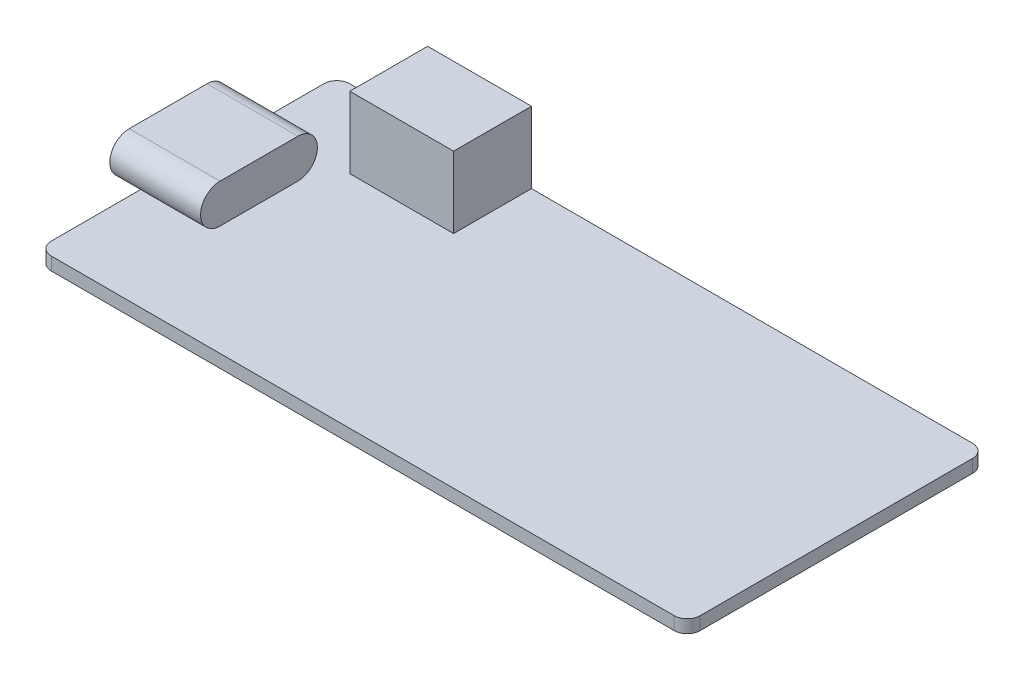
ISO-10303-21;
HEADER;
FILE_DESCRIPTION(('STEP AP214'),'2;1');
FILE_NAME('part.step','',(''),(''),'','','');
FILE_SCHEMA(('AUTOMOTIVE_DESIGN { 1 0 10303 214 1 1 1 1 }'));
ENDSEC;
DATA;
#1=APPLICATION_CONTEXT('core data for automotive mechanical design processes');
#2=APPLICATION_PROTOCOL_DEFINITION('international standard','automotive_design',2000,#1);
#3=PRODUCT_CONTEXT('',#1,'mechanical');
#4=PRODUCT('Part','Part','',(#3));
#5=PRODUCT_RELATED_PRODUCT_CATEGORY('part','',(#4));
#6=PRODUCT_DEFINITION_FORMATION('','',#4);
#7=PRODUCT_DEFINITION_CONTEXT('part definition',#1,'design');
#8=PRODUCT_DEFINITION('design','',#6,#7);
#9=PRODUCT_DEFINITION_SHAPE('','',#8);
#10=(LENGTH_UNIT() NAMED_UNIT(*) SI_UNIT(.MILLI.,.METRE.));
#11=(NAMED_UNIT(*) PLANE_ANGLE_UNIT() SI_UNIT($,.RADIAN.));
#12=(NAMED_UNIT(*) SI_UNIT($,.STERADIAN.) SOLID_ANGLE_UNIT());
#13=UNCERTAINTY_MEASURE_WITH_UNIT(LENGTH_MEASURE(1.E-05),#10,'distance_accuracy_value','');
#14=(GEOMETRIC_REPRESENTATION_CONTEXT(3) GLOBAL_UNCERTAINTY_ASSIGNED_CONTEXT((#13)) GLOBAL_UNIT_ASSIGNED_CONTEXT((#10,
#11,#12)) REPRESENTATION_CONTEXT('',''));
#15=CARTESIAN_POINT('',(0.,0.,0.));
#16=DIRECTION('',(0.,0.,1.));
#17=DIRECTION('',(1.,0.,0.));
#18=AXIS2_PLACEMENT_3D('',#15,#16,#17);
#19=CARTESIAN_POINT('',(0.,1.,0.));
#20=DIRECTION('',(0.,-1.,0.));
#21=DIRECTION('',(0.,0.,-1.));
#22=AXIS2_PLACEMENT_3D('',#19,#20,#21);
#23=PLANE('',#22);
#24=DIRECTION('',(0.,0.,1.));
#25=VECTOR('',#24,1.);
#26=CARTESIAN_POINT('',(7.,1.,-23.));
#27=LINE('',#26,#25);
#28=CARTESIAN_POINT('',(7.,1.,-23.));
#29=VERTEX_POINT('',#28);
#30=CARTESIAN_POINT('',(7.,1.,-17.));
#31=VERTEX_POINT('',#30);
#32=EDGE_CURVE('E172',#29,#31,#27,.T.);
#33=ORIENTED_EDGE('',*,*,#32,.F.);
#34=DIRECTION('',(-1.,0.,0.));
#35=VECTOR('',#34,1.);
#36=CARTESIAN_POINT('',(0.,1.,-23.));
#37=LINE('',#36,#35);
#38=CARTESIAN_POINT('',(1.,1.,-23.));
#39=VERTEX_POINT('',#38);
#40=EDGE_CURVE('E224',#29,#39,#37,.T.);
#41=ORIENTED_EDGE('',*,*,#40,.T.);
#42=CARTESIAN_POINT('',(1.,1.,-22.));
#43=DIRECTION('',(0.,-1.,0.));
#44=DIRECTION('',(0.,0.,-1.));
#45=AXIS2_PLACEMENT_3D('',#42,#43,#44);
#46=CIRCLE('',#45,1.);
#47=CARTESIAN_POINT('',(0.,1.,-22.));
#48=VERTEX_POINT('',#47);
#49=EDGE_CURVE('E258',#39,#48,#46,.F.);
#50=ORIENTED_EDGE('',*,*,#49,.T.);
#51=DIRECTION('',(0.,0.,1.));
#52=VECTOR('',#51,1.);
#53=CARTESIAN_POINT('',(0.,1.,0.));
#54=LINE('',#53,#52);
#55=CARTESIAN_POINT('',(0.,1.,-14.5));
#56=VERTEX_POINT('',#55);
#57=EDGE_CURVE('E213',#48,#56,#54,.T.);
#58=ORIENTED_EDGE('',*,*,#57,.T.);
#59=DIRECTION('',(-1.,0.,0.));
#60=VECTOR('',#59,1.);
#61=CARTESIAN_POINT('',(5.5,0.999999999999999,-14.5));
#62=LINE('',#61,#60);
#63=CARTESIAN_POINT('',(5.5,0.999999999999999,-14.5));
#64=VERTEX_POINT('',#63);
#65=EDGE_CURVE('E206',#64,#56,#62,.T.);
#66=ORIENTED_EDGE('',*,*,#65,.F.);
#67=DIRECTION('',(0.,0.,1.));
#68=VECTOR('',#67,1.);
#69=CARTESIAN_POINT('',(5.5,0.999999999999999,-8.5));
#70=LINE('',#69,#68);
#71=CARTESIAN_POINT('',(5.5,1.,-8.5));
#72=VERTEX_POINT('',#71);
#73=EDGE_CURVE('E199',#64,#72,#70,.T.);
#74=ORIENTED_EDGE('',*,*,#73,.T.);
#75=DIRECTION('',(-1.,0.,0.));
#76=VECTOR('',#75,1.);
#77=CARTESIAN_POINT('',(5.5,0.999999999999999,-8.5));
#78=LINE('',#77,#76);
#79=CARTESIAN_POINT('',(0.,1.,-8.5));
#80=VERTEX_POINT('',#79);
#81=EDGE_CURVE('E202',#72,#80,#78,.T.);
#82=ORIENTED_EDGE('',*,*,#81,.T.);
#83=CARTESIAN_POINT('',(0.,1.,-1.));
#84=VERTEX_POINT('',#83);
#85=EDGE_CURVE('E218',#80,#84,#54,.T.);
#86=ORIENTED_EDGE('',*,*,#85,.T.);
#87=CARTESIAN_POINT('',(1.,1.,-1.));
#88=DIRECTION('',(0.,-1.,0.));
#89=DIRECTION('',(0.,0.,-1.));
#90=AXIS2_PLACEMENT_3D('',#87,#88,#89);
#91=CIRCLE('',#90,1.);
#92=CARTESIAN_POINT('',(1.,1.,0.));
#93=VERTEX_POINT('',#92);
#94=EDGE_CURVE('E256',#84,#93,#91,.F.);
#95=ORIENTED_EDGE('',*,*,#94,.T.);
#96=DIRECTION('',(1.,0.,0.));
#97=VECTOR('',#96,1.);
#98=CARTESIAN_POINT('',(0.,1.,0.));
#99=LINE('',#98,#97);
#100=CARTESIAN_POINT('',(49.,1.,0.));
#101=VERTEX_POINT('',#100);
#102=EDGE_CURVE('E216',#93,#101,#99,.T.);
#103=ORIENTED_EDGE('',*,*,#102,.T.);
#104=CARTESIAN_POINT('',(49.,1.,-1.));
#105=DIRECTION('',(0.,-1.,0.));
#106=DIRECTION('',(0.,0.,-1.));
#107=AXIS2_PLACEMENT_3D('',#104,#105,#106);
#108=CIRCLE('',#107,1.);
#109=CARTESIAN_POINT('',(50.,1.,-1.));
#110=VERTEX_POINT('',#109);
#111=EDGE_CURVE('E262',#101,#110,#108,.F.);
#112=ORIENTED_EDGE('',*,*,#111,.T.);
#113=DIRECTION('',(0.,0.,-1.));
#114=VECTOR('',#113,1.);
#115=CARTESIAN_POINT('',(50.,1.,0.));
#116=LINE('',#115,#114);
#117=CARTESIAN_POINT('',(50.,1.,-22.));
#118=VERTEX_POINT('',#117);
#119=EDGE_CURVE('E221',#110,#118,#116,.T.);
#120=ORIENTED_EDGE('',*,*,#119,.T.);
#121=CARTESIAN_POINT('',(49.,1.,-22.));
#122=DIRECTION('',(0.,-1.,0.));
#123=DIRECTION('',(0.,0.,-1.));
#124=AXIS2_PLACEMENT_3D('',#121,#122,#123);
#125=CIRCLE('',#124,1.);
#126=CARTESIAN_POINT('',(49.,1.,-23.));
#127=VERTEX_POINT('',#126);
#128=EDGE_CURVE('E260',#118,#127,#125,.F.);
#129=ORIENTED_EDGE('',*,*,#128,.T.);
#130=CARTESIAN_POINT('',(15.,1.,-23.));
#131=VERTEX_POINT('',#130);
#132=EDGE_CURVE('E225',#127,#131,#37,.T.);
#133=ORIENTED_EDGE('',*,*,#132,.T.);
#134=DIRECTION('',(0.,0.,-1.));
#135=VECTOR('',#134,1.);
#136=CARTESIAN_POINT('',(15.,1.,-23.));
#137=LINE('',#136,#135);
#138=CARTESIAN_POINT('',(15.,1.,-17.));
#139=VERTEX_POINT('',#138);
#140=EDGE_CURVE('E53',#139,#131,#137,.T.);
#141=ORIENTED_EDGE('',*,*,#140,.F.);
#142=DIRECTION('',(1.,0.,0.));
#143=VECTOR('',#142,1.);
#144=CARTESIAN_POINT('',(7.,1.,-17.));
#145=LINE('',#144,#143);
#146=EDGE_CURVE('E48',#31,#139,#145,.T.);
#147=ORIENTED_EDGE('',*,*,#146,.F.);
#148=EDGE_LOOP('',(#33,#41,#50,#58,#66,#74,#82,#86,#95,#103,#112,#120,#129,#133,#141,#147));
#149=FACE_BOUND('',#148,.T.);
#150=ADVANCED_FACE('F33',(#149),#23,.F.);
#151=CARTESIAN_POINT('',(0.,1.,0.));
#152=DIRECTION('',(1.,0.,0.));
#153=DIRECTION('',(0.,0.,-1.));
#154=AXIS2_PLACEMENT_3D('',#151,#152,#153);
#155=PLANE('',#154);
#156=ORIENTED_EDGE('',*,*,#57,.F.);
#157=DIRECTION('',(0.,-1.,0.));
#158=VECTOR('',#157,1.);
#159=CARTESIAN_POINT('',(0.,1.,-22.));
#160=LINE('',#159,#158);
#161=CARTESIAN_POINT('',(0.,0.,-22.));
#162=VERTEX_POINT('',#161);
#163=EDGE_CURVE('E11',#48,#162,#160,.T.);
#164=ORIENTED_EDGE('',*,*,#163,.T.);
#165=DIRECTION('',(0.,0.,1.));
#166=VECTOR('',#165,1.);
#167=CARTESIAN_POINT('',(0.,0.,0.));
#168=LINE('',#167,#166);
#169=CARTESIAN_POINT('',(0.,0.,-1.));
#170=VERTEX_POINT('',#169);
#171=EDGE_CURVE('E204',#162,#170,#168,.T.);
#172=ORIENTED_EDGE('',*,*,#171,.T.);
#173=DIRECTION('',(0.,-1.,0.));
#174=VECTOR('',#173,1.);
#175=CARTESIAN_POINT('',(0.,1.,-1.));
#176=LINE('',#175,#174);
#177=EDGE_CURVE('E41',#170,#84,#176,.F.);
#178=ORIENTED_EDGE('',*,*,#177,.T.);
#179=ORIENTED_EDGE('',*,*,#85,.F.);
#180=EDGE_CURVE('E217',#56,#80,#54,.T.);
#181=ORIENTED_EDGE('',*,*,#180,.F.);
#182=EDGE_LOOP('',(#156,#164,#172,#178,#179,#181));
#183=FACE_BOUND('',#182,.T.);
#184=ADVANCED_FACE('F275',(#183),#155,.F.);
#185=CARTESIAN_POINT('',(0.,1.,0.));
#186=DIRECTION('',(0.,0.,-1.));
#187=DIRECTION('',(-1.,0.,0.));
#188=AXIS2_PLACEMENT_3D('',#185,#186,#187);
#189=PLANE('',#188);
#190=DIRECTION('',(1.,0.,0.));
#191=VECTOR('',#190,1.);
#192=CARTESIAN_POINT('',(0.,0.,0.));
#193=LINE('',#192,#191);
#194=CARTESIAN_POINT('',(1.,0.,0.));
#195=VERTEX_POINT('',#194);
#196=CARTESIAN_POINT('',(49.,0.,0.));
#197=VERTEX_POINT('',#196);
#198=EDGE_CURVE('E230',#195,#197,#193,.T.);
#199=ORIENTED_EDGE('',*,*,#198,.T.);
#200=DIRECTION('',(0.,-1.,0.));
#201=VECTOR('',#200,1.);
#202=CARTESIAN_POINT('',(49.,1.,0.));
#203=LINE('',#202,#201);
#204=EDGE_CURVE('E254',#197,#101,#203,.F.);
#205=ORIENTED_EDGE('',*,*,#204,.T.);
#206=ORIENTED_EDGE('',*,*,#102,.F.);
#207=DIRECTION('',(0.,-1.,0.));
#208=VECTOR('',#207,1.);
#209=CARTESIAN_POINT('',(1.,1.,0.));
#210=LINE('',#209,#208);
#211=EDGE_CURVE('E251',#93,#195,#210,.T.);
#212=ORIENTED_EDGE('',*,*,#211,.T.);
#213=EDGE_LOOP('',(#199,#205,#206,#212));
#214=FACE_BOUND('',#213,.T.);
#215=ADVANCED_FACE('F283',(#214),#189,.F.);
#216=CARTESIAN_POINT('',(50.,1.,0.));
#217=DIRECTION('',(-1.,0.,0.));
#218=DIRECTION('',(0.,0.,1.));
#219=AXIS2_PLACEMENT_3D('',#216,#217,#218);
#220=PLANE('',#219);
#221=ORIENTED_EDGE('',*,*,#119,.F.);
#222=DIRECTION('',(0.,-1.,0.));
#223=VECTOR('',#222,1.);
#224=CARTESIAN_POINT('',(50.,1.,-1.));
#225=LINE('',#224,#223);
#226=CARTESIAN_POINT('',(50.,0.,-1.));
#227=VERTEX_POINT('',#226);
#228=EDGE_CURVE('E240',#110,#227,#225,.T.);
#229=ORIENTED_EDGE('',*,*,#228,.T.);
#230=DIRECTION('',(0.,0.,-1.));
#231=VECTOR('',#230,1.);
#232=CARTESIAN_POINT('',(50.,0.,0.));
#233=LINE('',#232,#231);
#234=CARTESIAN_POINT('',(50.,0.,-22.));
#235=VERTEX_POINT('',#234);
#236=EDGE_CURVE('E233',#227,#235,#233,.T.);
#237=ORIENTED_EDGE('',*,*,#236,.T.);
#238=DIRECTION('',(0.,-1.,0.));
#239=VECTOR('',#238,1.);
#240=CARTESIAN_POINT('',(50.,1.,-22.));
#241=LINE('',#240,#239);
#242=EDGE_CURVE('E227',#235,#118,#241,.F.);
#243=ORIENTED_EDGE('',*,*,#242,.T.);
#244=EDGE_LOOP('',(#221,#229,#237,#243));
#245=FACE_BOUND('',#244,.T.);
#246=ADVANCED_FACE('F292',(#245),#220,.F.);
#247=CARTESIAN_POINT('',(0.,1.,-23.));
#248=DIRECTION('',(0.,0.,1.));
#249=DIRECTION('',(1.,0.,0.));
#250=AXIS2_PLACEMENT_3D('',#247,#248,#249);
#251=PLANE('',#250);
#252=ORIENTED_EDGE('',*,*,#132,.F.);
#253=DIRECTION('',(0.,-1.,0.));
#254=VECTOR('',#253,1.);
#255=CARTESIAN_POINT('',(49.,1.,-23.));
#256=LINE('',#255,#254);
#257=CARTESIAN_POINT('',(49.,0.,-23.));
#258=VERTEX_POINT('',#257);
#259=EDGE_CURVE('E267',#127,#258,#256,.T.);
#260=ORIENTED_EDGE('',*,*,#259,.T.);
#261=DIRECTION('',(-1.,0.,0.));
#262=VECTOR('',#261,1.);
#263=CARTESIAN_POINT('',(0.,0.,-23.));
#264=LINE('',#263,#262);
#265=CARTESIAN_POINT('',(1.,0.,-23.));
#266=VERTEX_POINT('',#265);
#267=EDGE_CURVE('E236',#258,#266,#264,.T.);
#268=ORIENTED_EDGE('',*,*,#267,.T.);
#269=DIRECTION('',(0.,-1.,0.));
#270=VECTOR('',#269,1.);
#271=CARTESIAN_POINT('',(1.,1.,-23.));
#272=LINE('',#271,#270);
#273=EDGE_CURVE('E264',#266,#39,#272,.F.);
#274=ORIENTED_EDGE('',*,*,#273,.T.);
#275=ORIENTED_EDGE('',*,*,#40,.F.);
#276=DIRECTION('',(0.,-1.,0.));
#277=VECTOR('',#276,1.);
#278=CARTESIAN_POINT('',(7.,6.5,-23.));
#279=LINE('',#278,#277);
#280=CARTESIAN_POINT('',(7.,6.5,-23.));
#281=VERTEX_POINT('',#280);
#282=EDGE_CURVE('E305',#281,#29,#279,.T.);
#283=ORIENTED_EDGE('',*,*,#282,.F.);
#284=DIRECTION('',(-1.,0.,0.));
#285=VECTOR('',#284,1.);
#286=CARTESIAN_POINT('',(7.,6.5,-23.));
#287=LINE('',#286,#285);
#288=CARTESIAN_POINT('',(15.,6.5,-23.));
#289=VERTEX_POINT('',#288);
#290=EDGE_CURVE('E166',#289,#281,#287,.T.);
#291=ORIENTED_EDGE('',*,*,#290,.F.);
#292=DIRECTION('',(0.,-1.,0.));
#293=VECTOR('',#292,1.);
#294=CARTESIAN_POINT('',(15.,6.5,-23.));
#295=LINE('',#294,#293);
#296=EDGE_CURVE('E178',#289,#131,#295,.T.);
#297=ORIENTED_EDGE('',*,*,#296,.T.);
#298=EDGE_LOOP('',(#252,#260,#268,#274,#275,#283,#291,#297));
#299=FACE_BOUND('',#298,.T.);
#300=ADVANCED_FACE('F301',(#299),#251,.F.);
#301=CARTESIAN_POINT('',(0.,0.,0.));
#302=DIRECTION('',(0.,-1.,0.));
#303=DIRECTION('',(0.,0.,-1.));
#304=AXIS2_PLACEMENT_3D('',#301,#302,#303);
#305=PLANE('',#304);
#306=ORIENTED_EDGE('',*,*,#236,.F.);
#307=CARTESIAN_POINT('',(49.,0.,-1.));
#308=DIRECTION('',(0.,-1.,0.));
#309=DIRECTION('',(0.,0.,-1.));
#310=AXIS2_PLACEMENT_3D('',#307,#308,#309);
#311=CIRCLE('',#310,1.);
#312=EDGE_CURVE('E249',#227,#197,#311,.T.);
#313=ORIENTED_EDGE('',*,*,#312,.T.);
#314=ORIENTED_EDGE('',*,*,#198,.F.);
#315=CARTESIAN_POINT('',(1.,0.,-1.));
#316=DIRECTION('',(0.,-1.,0.));
#317=DIRECTION('',(0.,0.,-1.));
#318=AXIS2_PLACEMENT_3D('',#315,#316,#317);
#319=CIRCLE('',#318,1.);
#320=EDGE_CURVE('E243',#195,#170,#319,.T.);
#321=ORIENTED_EDGE('',*,*,#320,.T.);
#322=ORIENTED_EDGE('',*,*,#171,.F.);
#323=CARTESIAN_POINT('',(1.,0.,-22.));
#324=DIRECTION('',(0.,-1.,0.));
#325=DIRECTION('',(0.,0.,-1.));
#326=AXIS2_PLACEMENT_3D('',#323,#324,#325);
#327=CIRCLE('',#326,1.);
#328=EDGE_CURVE('E245',#162,#266,#327,.T.);
#329=ORIENTED_EDGE('',*,*,#328,.T.);
#330=ORIENTED_EDGE('',*,*,#267,.F.);
#331=CARTESIAN_POINT('',(49.,0.,-22.));
#332=DIRECTION('',(0.,-1.,0.));
#333=DIRECTION('',(0.,0.,-1.));
#334=AXIS2_PLACEMENT_3D('',#331,#332,#333);
#335=CIRCLE('',#334,1.);
#336=EDGE_CURVE('E247',#258,#235,#335,.T.);
#337=ORIENTED_EDGE('',*,*,#336,.T.);
#338=EDGE_LOOP('',(#306,#313,#314,#321,#322,#329,#330,#337));
#339=FACE_BOUND('',#338,.T.);
#340=ADVANCED_FACE('F331',(#339),#305,.T.);
#341=CARTESIAN_POINT('',(49.,1.,-1.));
#342=DIRECTION('',(0.,-1.,0.));
#343=DIRECTION('',(0.,0.,-1.));
#344=AXIS2_PLACEMENT_3D('',#341,#342,#343);
#345=CYLINDRICAL_SURFACE('',#344,1.);
#346=ORIENTED_EDGE('',*,*,#111,.F.);
#347=ORIENTED_EDGE('',*,*,#204,.F.);
#348=ORIENTED_EDGE('',*,*,#312,.F.);
#349=ORIENTED_EDGE('',*,*,#228,.F.);
#350=EDGE_LOOP('',(#346,#347,#348,#349));
#351=FACE_BOUND('',#350,.T.);
#352=ADVANCED_FACE('F287',(#351),#345,.T.);
#353=CARTESIAN_POINT('',(49.,1.,-22.));
#354=DIRECTION('',(0.,-1.,0.));
#355=DIRECTION('',(0.,0.,-1.));
#356=AXIS2_PLACEMENT_3D('',#353,#354,#355);
#357=CYLINDRICAL_SURFACE('',#356,1.);
#358=ORIENTED_EDGE('',*,*,#128,.F.);
#359=ORIENTED_EDGE('',*,*,#242,.F.);
#360=ORIENTED_EDGE('',*,*,#336,.F.);
#361=ORIENTED_EDGE('',*,*,#259,.F.);
#362=EDGE_LOOP('',(#358,#359,#360,#361));
#363=FACE_BOUND('',#362,.T.);
#364=ADVANCED_FACE('F296',(#363),#357,.T.);
#365=CARTESIAN_POINT('',(1.,1.,-22.));
#366=DIRECTION('',(0.,-1.,0.));
#367=DIRECTION('',(0.,0.,-1.));
#368=AXIS2_PLACEMENT_3D('',#365,#366,#367);
#369=CYLINDRICAL_SURFACE('',#368,1.);
#370=ORIENTED_EDGE('',*,*,#49,.F.);
#371=ORIENTED_EDGE('',*,*,#273,.F.);
#372=ORIENTED_EDGE('',*,*,#328,.F.);
#373=ORIENTED_EDGE('',*,*,#163,.F.);
#374=EDGE_LOOP('',(#370,#371,#372,#373));
#375=FACE_BOUND('',#374,.T.);
#376=ADVANCED_FACE('F344',(#375),#369,.T.);
#377=CARTESIAN_POINT('',(1.,1.,-1.));
#378=DIRECTION('',(0.,-1.,0.));
#379=DIRECTION('',(0.,0.,-1.));
#380=AXIS2_PLACEMENT_3D('',#377,#378,#379);
#381=CYLINDRICAL_SURFACE('',#380,1.);
#382=ORIENTED_EDGE('',*,*,#94,.F.);
#383=ORIENTED_EDGE('',*,*,#177,.F.);
#384=ORIENTED_EDGE('',*,*,#320,.F.);
#385=ORIENTED_EDGE('',*,*,#211,.F.);
#386=EDGE_LOOP('',(#382,#383,#384,#385));
#387=FACE_BOUND('',#386,.T.);
#388=ADVANCED_FACE('F35',(#387),#381,.T.);
#389=CARTESIAN_POINT('',(5.5,0.999999999999999,-8.5));
#390=DIRECTION('',(0.,-1.,0.));
#391=DIRECTION('',(0.,0.,-1.));
#392=AXIS2_PLACEMENT_3D('',#389,#390,#391);
#393=PLANE('',#392);
#394=ORIENTED_EDGE('',*,*,#180,.T.);
#395=CARTESIAN_POINT('',(-1.5,0.999999999999999,-8.5));
#396=VERTEX_POINT('',#395);
#397=EDGE_CURVE('E205',#80,#396,#78,.T.);
#398=ORIENTED_EDGE('',*,*,#397,.T.);
#399=DIRECTION('',(0.,0.,1.));
#400=VECTOR('',#399,1.);
#401=CARTESIAN_POINT('',(-1.5,0.999999999999999,-8.5));
#402=LINE('',#401,#400);
#403=CARTESIAN_POINT('',(-1.5,0.999999999999999,-14.5));
#404=VERTEX_POINT('',#403);
#405=EDGE_CURVE('E187',#404,#396,#402,.T.);
#406=ORIENTED_EDGE('',*,*,#405,.F.);
#407=EDGE_CURVE('E209',#56,#404,#62,.T.);
#408=ORIENTED_EDGE('',*,*,#407,.F.);
#409=EDGE_LOOP('',(#394,#398,#406,#408));
#410=FACE_BOUND('',#409,.T.);
#411=ADVANCED_FACE('F350',(#410),#393,.T.);
#412=CARTESIAN_POINT('',(5.5,2.5,-8.5));
#413=DIRECTION('',(-1.,0.,0.));
#414=DIRECTION('',(0.,0.,1.));
#415=AXIS2_PLACEMENT_3D('',#412,#413,#414);
#416=CYLINDRICAL_SURFACE('',#415,1.5);
#417=DIRECTION('',(-1.,0.,0.));
#418=VECTOR('',#417,1.);
#419=CARTESIAN_POINT('',(5.5,4.,-8.5));
#420=LINE('',#419,#418);
#421=CARTESIAN_POINT('',(5.5,4.,-8.5));
#422=VERTEX_POINT('',#421);
#423=CARTESIAN_POINT('',(-1.5,4.,-8.5));
#424=VERTEX_POINT('',#423);
#425=EDGE_CURVE('E201',#422,#424,#420,.T.);
#426=ORIENTED_EDGE('',*,*,#425,.T.);
#427=CARTESIAN_POINT('',(-1.5,2.5,-8.5));
#428=DIRECTION('',(-1.,0.,0.));
#429=DIRECTION('',(0.,0.,1.));
#430=AXIS2_PLACEMENT_3D('',#427,#428,#429);
#431=CIRCLE('',#430,1.5);
#432=EDGE_CURVE('E173',#396,#424,#431,.T.);
#433=ORIENTED_EDGE('',*,*,#432,.F.);
#434=ORIENTED_EDGE('',*,*,#397,.F.);
#435=ORIENTED_EDGE('',*,*,#81,.F.);
#436=CARTESIAN_POINT('',(5.5,2.5,-8.5));
#437=DIRECTION('',(-1.,0.,0.));
#438=DIRECTION('',(0.,0.,1.));
#439=AXIS2_PLACEMENT_3D('',#436,#437,#438);
#440=CIRCLE('',#439,1.5);
#441=EDGE_CURVE('E190',#72,#422,#440,.T.);
#442=ORIENTED_EDGE('',*,*,#441,.T.);
#443=EDGE_LOOP('',(#426,#433,#434,#435,#442));
#444=FACE_BOUND('',#443,.T.);
#445=ADVANCED_FACE('F329',(#444),#416,.T.);
#446=CARTESIAN_POINT('',(5.5,2.5,-14.5));
#447=DIRECTION('',(-1.,0.,0.));
#448=DIRECTION('',(0.,0.,1.));
#449=AXIS2_PLACEMENT_3D('',#446,#447,#448);
#450=CYLINDRICAL_SURFACE('',#449,1.5);
#451=ORIENTED_EDGE('',*,*,#65,.T.);
#452=ORIENTED_EDGE('',*,*,#407,.T.);
#453=CARTESIAN_POINT('',(-1.5,2.5,-14.5));
#454=DIRECTION('',(-1.,0.,0.));
#455=DIRECTION('',(0.,0.,1.));
#456=AXIS2_PLACEMENT_3D('',#453,#454,#455);
#457=CIRCLE('',#456,1.5);
#458=CARTESIAN_POINT('',(-1.5,4.,-14.5));
#459=VERTEX_POINT('',#458);
#460=EDGE_CURVE('E184',#459,#404,#457,.T.);
#461=ORIENTED_EDGE('',*,*,#460,.F.);
#462=DIRECTION('',(-1.,0.,0.));
#463=VECTOR('',#462,1.);
#464=CARTESIAN_POINT('',(5.5,4.,-14.5));
#465=LINE('',#464,#463);
#466=CARTESIAN_POINT('',(5.5,4.,-14.5));
#467=VERTEX_POINT('',#466);
#468=EDGE_CURVE('E210',#467,#459,#465,.T.);
#469=ORIENTED_EDGE('',*,*,#468,.F.);
#470=CARTESIAN_POINT('',(5.5,2.5,-14.5));
#471=DIRECTION('',(-1.,0.,0.));
#472=DIRECTION('',(0.,0.,1.));
#473=AXIS2_PLACEMENT_3D('',#470,#471,#472);
#474=CIRCLE('',#473,1.5);
#475=EDGE_CURVE('E196',#467,#64,#474,.T.);
#476=ORIENTED_EDGE('',*,*,#475,.T.);
#477=EDGE_LOOP('',(#451,#452,#461,#469,#476));
#478=FACE_BOUND('',#477,.T.);
#479=ADVANCED_FACE('F367',(#478),#450,.T.);
#480=CARTESIAN_POINT('',(5.5,4.,-8.5));
#481=DIRECTION('',(0.,1.,0.));
#482=DIRECTION('',(0.,0.,1.));
#483=AXIS2_PLACEMENT_3D('',#480,#481,#482);
#484=PLANE('',#483);
#485=ORIENTED_EDGE('',*,*,#468,.T.);
#486=DIRECTION('',(0.,0.,-1.));
#487=VECTOR('',#486,1.);
#488=CARTESIAN_POINT('',(-1.5,4.,-8.5));
#489=LINE('',#488,#487);
#490=EDGE_CURVE('E176',#424,#459,#489,.T.);
#491=ORIENTED_EDGE('',*,*,#490,.F.);
#492=ORIENTED_EDGE('',*,*,#425,.F.);
#493=DIRECTION('',(0.,0.,-1.));
#494=VECTOR('',#493,1.);
#495=CARTESIAN_POINT('',(5.5,4.,-8.5));
#496=LINE('',#495,#494);
#497=EDGE_CURVE('E193',#422,#467,#496,.T.);
#498=ORIENTED_EDGE('',*,*,#497,.T.);
#499=EDGE_LOOP('',(#485,#491,#492,#498));
#500=FACE_BOUND('',#499,.T.);
#501=ADVANCED_FACE('F374',(#500),#484,.T.);
#502=CARTESIAN_POINT('',(5.5,2.5,-8.5));
#503=DIRECTION('',(-1.,0.,0.));
#504=DIRECTION('',(0.,0.,1.));
#505=AXIS2_PLACEMENT_3D('',#502,#503,#504);
#506=PLANE('',#505);
#507=ORIENTED_EDGE('',*,*,#441,.F.);
#508=ORIENTED_EDGE('',*,*,#73,.F.);
#509=ORIENTED_EDGE('',*,*,#475,.F.);
#510=ORIENTED_EDGE('',*,*,#497,.F.);
#511=EDGE_LOOP('',(#507,#508,#509,#510));
#512=FACE_BOUND('',#511,.T.);
#513=ADVANCED_FACE('F371',(#512),#506,.F.);
#514=CARTESIAN_POINT('',(-1.5,2.5,-8.5));
#515=DIRECTION('',(-1.,0.,0.));
#516=DIRECTION('',(0.,0.,1.));
#517=AXIS2_PLACEMENT_3D('',#514,#515,#516);
#518=PLANE('',#517);
#519=ORIENTED_EDGE('',*,*,#432,.T.);
#520=ORIENTED_EDGE('',*,*,#490,.T.);
#521=ORIENTED_EDGE('',*,*,#460,.T.);
#522=ORIENTED_EDGE('',*,*,#405,.T.);
#523=EDGE_LOOP('',(#519,#520,#521,#522));
#524=FACE_BOUND('',#523,.T.);
#525=ADVANCED_FACE('F364',(#524),#518,.T.);
#526=CARTESIAN_POINT('',(7.,6.5,-23.));
#527=DIRECTION('',(1.,0.,0.));
#528=DIRECTION('',(0.,0.,-1.));
#529=AXIS2_PLACEMENT_3D('',#526,#527,#528);
#530=PLANE('',#529);
#531=ORIENTED_EDGE('',*,*,#32,.T.);
#532=DIRECTION('',(0.,-1.,0.));
#533=VECTOR('',#532,1.);
#534=CARTESIAN_POINT('',(7.,6.5,-17.));
#535=LINE('',#534,#533);
#536=CARTESIAN_POINT('',(7.,6.5,-17.));
#537=VERTEX_POINT('',#536);
#538=EDGE_CURVE('E154',#537,#31,#535,.T.);
#539=ORIENTED_EDGE('',*,*,#538,.F.);
#540=DIRECTION('',(0.,0.,1.));
#541=VECTOR('',#540,1.);
#542=CARTESIAN_POINT('',(7.,6.5,-23.));
#543=LINE('',#542,#541);
#544=EDGE_CURVE('E161',#281,#537,#543,.T.);
#545=ORIENTED_EDGE('',*,*,#544,.F.);
#546=ORIENTED_EDGE('',*,*,#282,.T.);
#547=EDGE_LOOP('',(#531,#539,#545,#546));
#548=FACE_BOUND('',#547,.T.);
#549=ADVANCED_FACE('F171',(#548),#530,.F.);
#550=CARTESIAN_POINT('',(7.,6.5,-17.));
#551=DIRECTION('',(0.,0.,-1.));
#552=DIRECTION('',(-1.,0.,0.));
#553=AXIS2_PLACEMENT_3D('',#550,#551,#552);
#554=PLANE('',#553);
#555=ORIENTED_EDGE('',*,*,#146,.T.);
#556=DIRECTION('',(0.,-1.,0.));
#557=VECTOR('',#556,1.);
#558=CARTESIAN_POINT('',(15.,6.5,-17.));
#559=LINE('',#558,#557);
#560=CARTESIAN_POINT('',(15.,6.5,-17.));
#561=VERTEX_POINT('',#560);
#562=EDGE_CURVE('E157',#561,#139,#559,.T.);
#563=ORIENTED_EDGE('',*,*,#562,.F.);
#564=DIRECTION('',(1.,0.,0.));
#565=VECTOR('',#564,1.);
#566=CARTESIAN_POINT('',(7.,6.5,-17.));
#567=LINE('',#566,#565);
#568=EDGE_CURVE('E150',#537,#561,#567,.T.);
#569=ORIENTED_EDGE('',*,*,#568,.F.);
#570=ORIENTED_EDGE('',*,*,#538,.T.);
#571=EDGE_LOOP('',(#555,#563,#569,#570));
#572=FACE_BOUND('',#571,.T.);
#573=ADVANCED_FACE('F152',(#572),#554,.F.);
#574=CARTESIAN_POINT('',(15.,6.5,-23.));
#575=DIRECTION('',(-1.,0.,0.));
#576=DIRECTION('',(0.,0.,1.));
#577=AXIS2_PLACEMENT_3D('',#574,#575,#576);
#578=PLANE('',#577);
#579=ORIENTED_EDGE('',*,*,#140,.T.);
#580=ORIENTED_EDGE('',*,*,#296,.F.);
#581=DIRECTION('',(0.,0.,-1.));
#582=VECTOR('',#581,1.);
#583=CARTESIAN_POINT('',(15.,6.5,-23.));
#584=LINE('',#583,#582);
#585=EDGE_CURVE('E160',#561,#289,#584,.T.);
#586=ORIENTED_EDGE('',*,*,#585,.F.);
#587=ORIENTED_EDGE('',*,*,#562,.T.);
#588=EDGE_LOOP('',(#579,#580,#586,#587));
#589=FACE_BOUND('',#588,.T.);
#590=ADVANCED_FACE('F312',(#589),#578,.F.);
#591=CARTESIAN_POINT('',(0.,6.5,0.));
#592=DIRECTION('',(0.,1.,0.));
#593=DIRECTION('',(0.,0.,1.));
#594=AXIS2_PLACEMENT_3D('',#591,#592,#593);
#595=PLANE('',#594);
#596=ORIENTED_EDGE('',*,*,#544,.T.);
#597=ORIENTED_EDGE('',*,*,#568,.T.);
#598=ORIENTED_EDGE('',*,*,#585,.T.);
#599=ORIENTED_EDGE('',*,*,#290,.T.);
#600=EDGE_LOOP('',(#596,#597,#598,#599));
#601=FACE_BOUND('',#600,.T.);
#602=ADVANCED_FACE('F164',(#601),#595,.T.);
#603=CLOSED_SHELL('',(#150,#184,#215,#246,#300,#340,#352,#364,#376,#388,#411,#445,#479,#501,
#513,#525,#549,#573,#590,#602));
#604=MANIFOLD_SOLID_BREP('B2',#603);
#605=ADVANCED_BREP_SHAPE_REPRESENTATION('',(#18,#604),#14);
#606=SHAPE_DEFINITION_REPRESENTATION(#9,#605);
ENDSEC;
END-ISO-10303-21;
